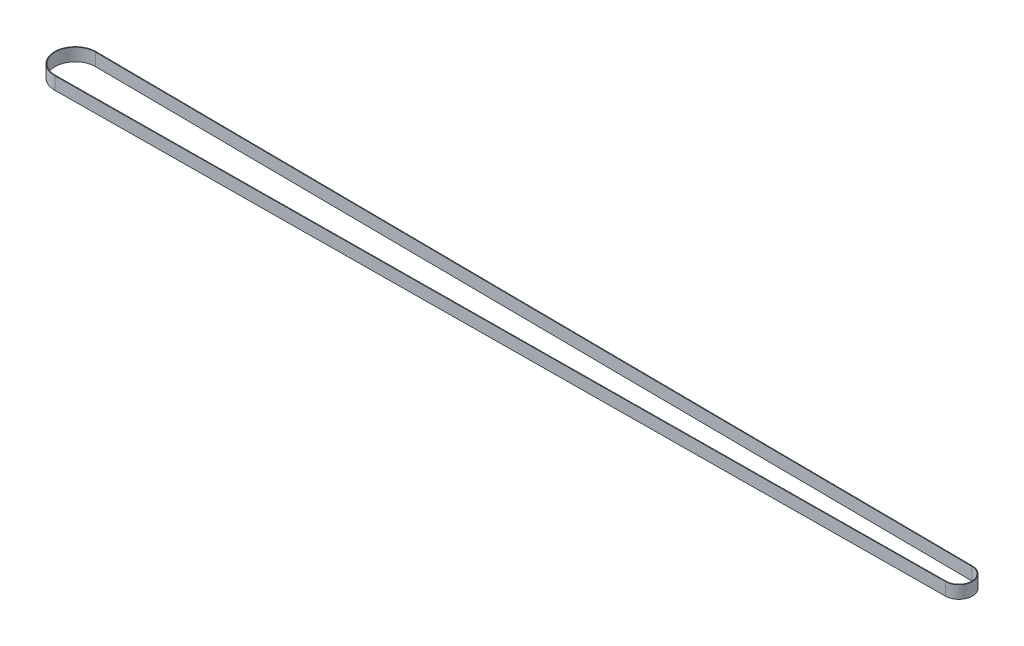
ISO-10303-21;
HEADER;
FILE_DESCRIPTION(('STEP AP214'),'2;1');
FILE_NAME('part.step','',(''),(''),'','','');
FILE_SCHEMA(('AUTOMOTIVE_DESIGN { 1 0 10303 214 1 1 1 1 }'));
ENDSEC;
DATA;
#1=APPLICATION_CONTEXT('core data for automotive mechanical design processes');
#2=APPLICATION_PROTOCOL_DEFINITION('international standard','automotive_design',2000,#1);
#3=PRODUCT_CONTEXT('',#1,'mechanical');
#4=PRODUCT('Part','Part','',(#3));
#5=PRODUCT_RELATED_PRODUCT_CATEGORY('part','',(#4));
#6=PRODUCT_DEFINITION_FORMATION('','',#4);
#7=PRODUCT_DEFINITION_CONTEXT('part definition',#1,'design');
#8=PRODUCT_DEFINITION('design','',#6,#7);
#9=PRODUCT_DEFINITION_SHAPE('','',#8);
#10=(LENGTH_UNIT() NAMED_UNIT(*) SI_UNIT(.MILLI.,.METRE.));
#11=(NAMED_UNIT(*) PLANE_ANGLE_UNIT() SI_UNIT($,.RADIAN.));
#12=(NAMED_UNIT(*) SI_UNIT($,.STERADIAN.) SOLID_ANGLE_UNIT());
#13=UNCERTAINTY_MEASURE_WITH_UNIT(LENGTH_MEASURE(1.E-05),#10,'distance_accuracy_value','');
#14=(GEOMETRIC_REPRESENTATION_CONTEXT(3) GLOBAL_UNCERTAINTY_ASSIGNED_CONTEXT((#13)) GLOBAL_UNIT_ASSIGNED_CONTEXT((#10,
#11,#12)) REPRESENTATION_CONTEXT('',''));
#15=CARTESIAN_POINT('',(0.,0.,0.));
#16=DIRECTION('',(0.,0.,1.));
#17=DIRECTION('',(1.,0.,0.));
#18=AXIS2_PLACEMENT_3D('',#15,#16,#17);
#19=CARTESIAN_POINT('',(0.0656349881038365,6.,8.02205410157994));
#20=DIRECTION('',(-0.00818154434132186,0.,-0.999966530605995));
#21=DIRECTION('',(-0.999966530605995,0.,0.00818154434132186));
#22=AXIS2_PLACEMENT_3D('',#19,#20,#21);
#23=PLANE('',#22);
#24=DIRECTION('',(0.999966530605995,0.,-0.00818154434132186));
#25=VECTOR('',#24,1.);
#26=CARTESIAN_POINT('',(0.0656349881038365,0.,8.02205410157994));
#27=LINE('',#26,#25);
#28=CARTESIAN_POINT('',(-221.966745805086,0.,9.83868267170606));
#29=VERTEX_POINT('',#28);
#30=CARTESIAN_POINT('',(196.972245325671,0.,6.41100001699983));
#31=VERTEX_POINT('',#30);
#32=EDGE_CURVE('E141',#29,#31,#27,.T.);
#33=ORIENTED_EDGE('',*,*,#32,.T.);
#34=DIRECTION('',(0.,-1.,0.));
#35=VECTOR('',#34,1.);
#36=CARTESIAN_POINT('',(196.972245325671,6.,6.41100001699983));
#37=LINE('',#36,#35);
#38=CARTESIAN_POINT('',(196.972245325671,6.,6.41100001699983));
#39=VERTEX_POINT('',#38);
#40=EDGE_CURVE('E11',#39,#31,#37,.T.);
#41=ORIENTED_EDGE('',*,*,#40,.F.);
#42=DIRECTION('',(0.999966530605995,0.,-0.00818154434132186));
#43=VECTOR('',#42,1.);
#44=CARTESIAN_POINT('',(0.0656349881038365,6.,8.02205410157994));
#45=LINE('',#44,#43);
#46=CARTESIAN_POINT('',(-221.966745805086,6.,9.83868267170606));
#47=VERTEX_POINT('',#46);
#48=EDGE_CURVE('E112',#47,#39,#45,.T.);
#49=ORIENTED_EDGE('',*,*,#48,.F.);
#50=DIRECTION('',(0.,-1.,0.));
#51=VECTOR('',#50,1.);
#52=CARTESIAN_POINT('',(-221.966745805086,6.,9.83868267170606));
#53=LINE('',#52,#51);
#54=EDGE_CURVE('E149',#47,#29,#53,.T.);
#55=ORIENTED_EDGE('',*,*,#54,.T.);
#56=EDGE_LOOP('',(#33,#41,#49,#55));
#57=FACE_BOUND('',#56,.T.);
#58=ADVANCED_FACE('F35',(#57),#23,.F.);
#59=CARTESIAN_POINT('',(196.972246791759,6.,0.));
#60=DIRECTION('',(0.,-1.,0.));
#61=DIRECTION('',(0.,0.,-1.));
#62=AXIS2_PLACEMENT_3D('',#59,#60,#61);
#63=CYLINDRICAL_SURFACE('',#62,6.41100001700001);
#64=CARTESIAN_POINT('',(196.972246791759,0.,0.));
#65=DIRECTION('',(0.,1.,0.));
#66=DIRECTION('',(0.,0.,1.));
#67=AXIS2_PLACEMENT_3D('',#64,#65,#66);
#68=CIRCLE('',#67,6.41100001700001);
#69=CARTESIAN_POINT('',(196.972246791759,0.,-6.41100001700002));
#70=VERTEX_POINT('',#69);
#71=EDGE_CURVE('E118',#31,#70,#68,.T.);
#72=ORIENTED_EDGE('',*,*,#71,.T.);
#73=DIRECTION('',(0.,-1.,0.));
#74=VECTOR('',#73,1.);
#75=CARTESIAN_POINT('',(196.972246791759,6.,-6.41100001700002));
#76=LINE('',#75,#74);
#77=CARTESIAN_POINT('',(196.972246791759,6.,-6.41100001700002));
#78=VERTEX_POINT('',#77);
#79=EDGE_CURVE('E45',#78,#70,#76,.T.);
#80=ORIENTED_EDGE('',*,*,#79,.F.);
#81=CARTESIAN_POINT('',(196.972246791759,6.,0.));
#82=DIRECTION('',(0.,1.,0.));
#83=DIRECTION('',(0.,0.,1.));
#84=AXIS2_PLACEMENT_3D('',#81,#82,#83);
#85=CIRCLE('',#84,6.41100001700001);
#86=EDGE_CURVE('E106',#39,#78,#85,.T.);
#87=ORIENTED_EDGE('',*,*,#86,.F.);
#88=ORIENTED_EDGE('',*,*,#40,.T.);
#89=EDGE_LOOP('',(#72,#80,#87,#88));
#90=FACE_BOUND('',#89,.T.);
#91=ADVANCED_FACE('F117',(#90),#63,.T.);
#92=CARTESIAN_POINT('',(0.0656349879261689,6.,-8.02205410793884));
#93=DIRECTION('',(0.0081815443126918,0.,-0.999966530606229));
#94=DIRECTION('',(-0.99996653060623,0.,-0.00818154431269181));
#95=AXIS2_PLACEMENT_3D('',#92,#93,#94);
#96=PLANE('',#95);
#97=DIRECTION('',(0.99996653060623,0.,0.00818154431269181));
#98=VECTOR('',#97,1.);
#99=CARTESIAN_POINT('',(0.0656349879261689,0.,-8.02205410793884));
#100=LINE('',#99,#98);
#101=CARTESIAN_POINT('',(-221.966745805086,0.,-9.83868267170606));
#102=VERTEX_POINT('',#101);
#103=EDGE_CURVE('E145',#102,#70,#100,.T.);
#104=ORIENTED_EDGE('',*,*,#103,.F.);
#105=DIRECTION('',(0.,-1.,0.));
#106=VECTOR('',#105,1.);
#107=CARTESIAN_POINT('',(-221.966745805086,6.,-9.83868267170606));
#108=LINE('',#107,#106);
#109=CARTESIAN_POINT('',(-221.966745805086,6.,-9.83868267170606));
#110=VERTEX_POINT('',#109);
#111=EDGE_CURVE('E82',#110,#102,#108,.T.);
#112=ORIENTED_EDGE('',*,*,#111,.F.);
#113=DIRECTION('',(0.99996653060623,0.,0.00818154431269181));
#114=VECTOR('',#113,1.);
#115=CARTESIAN_POINT('',(0.0656349879261689,6.,-8.02205410793884));
#116=LINE('',#115,#114);
#117=EDGE_CURVE('E110',#110,#78,#116,.T.);
#118=ORIENTED_EDGE('',*,*,#117,.T.);
#119=ORIENTED_EDGE('',*,*,#79,.T.);
#120=EDGE_LOOP('',(#104,#112,#118,#119));
#121=FACE_BOUND('',#120,.T.);
#122=ADVANCED_FACE('F123',(#121),#96,.T.);
#123=CARTESIAN_POINT('',(196.972246791759,6.,0.));
#124=DIRECTION('',(0.,-1.,0.));
#125=DIRECTION('',(0.,0.,-1.));
#126=AXIS2_PLACEMENT_3D('',#123,#124,#125);
#127=CYLINDRICAL_SURFACE('',#126,6.09599999999999);
#128=CARTESIAN_POINT('',(196.972246791759,0.,0.));
#129=DIRECTION('',(0.,1.,0.));
#130=DIRECTION('',(0.,0.,1.));
#131=AXIS2_PLACEMENT_3D('',#128,#129,#130);
#132=CIRCLE('',#131,6.09599999999999);
#133=CARTESIAN_POINT('',(196.972246791759,0.,6.09599999999999));
#134=VERTEX_POINT('',#133);
#135=CARTESIAN_POINT('',(196.972246791759,0.,-6.09599999999999));
#136=VERTEX_POINT('',#135);
#137=EDGE_CURVE('E129',#134,#136,#132,.T.);
#138=ORIENTED_EDGE('',*,*,#137,.F.);
#139=DIRECTION('',(0.,-1.,0.));
#140=VECTOR('',#139,1.);
#141=CARTESIAN_POINT('',(196.972246791759,6.,6.09599999999999));
#142=LINE('',#141,#140);
#143=CARTESIAN_POINT('',(196.972246791759,6.,6.09599999999999));
#144=VERTEX_POINT('',#143);
#145=EDGE_CURVE('E39',#144,#134,#142,.T.);
#146=ORIENTED_EDGE('',*,*,#145,.F.);
#147=CARTESIAN_POINT('',(196.972246791759,6.,0.));
#148=DIRECTION('',(0.,1.,0.));
#149=DIRECTION('',(0.,0.,1.));
#150=AXIS2_PLACEMENT_3D('',#147,#148,#149);
#151=CIRCLE('',#150,6.09599999999999);
#152=CARTESIAN_POINT('',(196.972246791759,6.,-6.09599999999999));
#153=VERTEX_POINT('',#152);
#154=EDGE_CURVE('E148',#144,#153,#151,.T.);
#155=ORIENTED_EDGE('',*,*,#154,.T.);
#156=DIRECTION('',(0.,-1.,0.));
#157=VECTOR('',#156,1.);
#158=CARTESIAN_POINT('',(196.972246791759,6.,-6.09599999999999));
#159=LINE('',#158,#157);
#160=EDGE_CURVE('E125',#153,#136,#159,.T.);
#161=ORIENTED_EDGE('',*,*,#160,.T.);
#162=EDGE_LOOP('',(#138,#146,#155,#161));
#163=FACE_BOUND('',#162,.T.);
#164=ADVANCED_FACE('F37',(#163),#127,.F.);
#165=CARTESIAN_POINT('',(0.0630578878522449,6.,7.70707518194105));
#166=DIRECTION('',(0.00818154434132178,0.,0.999966530605995));
#167=DIRECTION('',(0.999966530605995,0.,-0.00818154434132178));
#168=AXIS2_PLACEMENT_3D('',#165,#166,#167);
#169=PLANE('',#168);
#170=DIRECTION('',(-0.999966530605995,0.,0.00818154434132178));
#171=VECTOR('',#170,1.);
#172=CARTESIAN_POINT('',(0.0630578878522449,0.,7.70707518194105));
#173=LINE('',#172,#171);
#174=CARTESIAN_POINT('',(-221.971900005025,0.,9.52372483742822));
#175=VERTEX_POINT('',#174);
#176=EDGE_CURVE('E132',#134,#175,#173,.T.);
#177=ORIENTED_EDGE('',*,*,#176,.T.);
#178=DIRECTION('',(0.,-1.,0.));
#179=VECTOR('',#178,1.);
#180=CARTESIAN_POINT('',(-221.971900005025,6.,9.52372483742822));
#181=LINE('',#180,#179);
#182=CARTESIAN_POINT('',(-221.971900005025,6.,9.52372483742822));
#183=VERTEX_POINT('',#182);
#184=EDGE_CURVE('E154',#183,#175,#181,.T.);
#185=ORIENTED_EDGE('',*,*,#184,.F.);
#186=DIRECTION('',(-0.999966530605995,0.,0.00818154434132178));
#187=VECTOR('',#186,1.);
#188=CARTESIAN_POINT('',(0.0630578878522449,6.,7.70707518194105));
#189=LINE('',#188,#187);
#190=EDGE_CURVE('E162',#144,#183,#189,.T.);
#191=ORIENTED_EDGE('',*,*,#190,.F.);
#192=ORIENTED_EDGE('',*,*,#145,.T.);
#193=EDGE_LOOP('',(#177,#185,#191,#192));
#194=FACE_BOUND('',#193,.T.);
#195=ADVANCED_FACE('F161',(#194),#169,.F.);
#196=CARTESIAN_POINT('',(-222.127753208241,6.,0.));
#197=DIRECTION('',(0.,-1.,0.));
#198=DIRECTION('',(0.,0.,-1.));
#199=AXIS2_PLACEMENT_3D('',#196,#197,#198);
#200=CYLINDRICAL_SURFACE('',#199,9.525);
#201=CARTESIAN_POINT('',(-222.127753208241,0.,0.));
#202=DIRECTION('',(0.,1.,0.));
#203=DIRECTION('',(0.,0.,1.));
#204=AXIS2_PLACEMENT_3D('',#201,#202,#203);
#205=CIRCLE('',#204,9.525);
#206=CARTESIAN_POINT('',(-221.971898539108,0.,-9.52372481343878));
#207=VERTEX_POINT('',#206);
#208=EDGE_CURVE('E135',#207,#175,#205,.T.);
#209=ORIENTED_EDGE('',*,*,#208,.F.);
#210=DIRECTION('',(0.,-1.,0.));
#211=VECTOR('',#210,1.);
#212=CARTESIAN_POINT('',(-221.971898539108,6.,-9.52372481343878));
#213=LINE('',#212,#211);
#214=CARTESIAN_POINT('',(-221.971898539108,6.,-9.52372481343878));
#215=VERTEX_POINT('',#214);
#216=EDGE_CURVE('E153',#215,#207,#213,.T.);
#217=ORIENTED_EDGE('',*,*,#216,.F.);
#218=CARTESIAN_POINT('',(-222.127753208241,6.,0.));
#219=DIRECTION('',(0.,1.,0.));
#220=DIRECTION('',(0.,0.,1.));
#221=AXIS2_PLACEMENT_3D('',#218,#219,#220);
#222=CIRCLE('',#221,9.525);
#223=EDGE_CURVE('E202',#215,#183,#222,.T.);
#224=ORIENTED_EDGE('',*,*,#223,.T.);
#225=ORIENTED_EDGE('',*,*,#184,.T.);
#226=EDGE_LOOP('',(#209,#217,#224,#225));
#227=FACE_BOUND('',#226,.T.);
#228=ADVANCED_FACE('F174',(#227),#200,.F.);
#229=CARTESIAN_POINT('',(0.0630578875854573,6.,-7.70707517630515));
#230=DIRECTION('',(-0.00818154431269177,0.,0.999966530606229));
#231=DIRECTION('',(0.99996653060623,0.,0.00818154431269177));
#232=AXIS2_PLACEMENT_3D('',#229,#230,#231);
#233=PLANE('',#232);
#234=DIRECTION('',(-0.99996653060623,0.,-0.00818154431269177));
#235=VECTOR('',#234,1.);
#236=CARTESIAN_POINT('',(0.0630578875854573,0.,-7.70707517630515));
#237=LINE('',#236,#235);
#238=EDGE_CURVE('E138',#136,#207,#237,.T.);
#239=ORIENTED_EDGE('',*,*,#238,.F.);
#240=ORIENTED_EDGE('',*,*,#160,.F.);
#241=DIRECTION('',(-0.99996653060623,0.,-0.00818154431269177));
#242=VECTOR('',#241,1.);
#243=CARTESIAN_POINT('',(0.0630578875854573,6.,-7.70707517630515));
#244=LINE('',#243,#242);
#245=EDGE_CURVE('E172',#153,#215,#244,.T.);
#246=ORIENTED_EDGE('',*,*,#245,.T.);
#247=ORIENTED_EDGE('',*,*,#216,.T.);
#248=EDGE_LOOP('',(#239,#240,#246,#247));
#249=FACE_BOUND('',#248,.T.);
#250=ADVANCED_FACE('F171',(#249),#233,.T.);
#251=CARTESIAN_POINT('',(-222.127753208241,6.,0.));
#252=DIRECTION('',(0.,-1.,0.));
#253=DIRECTION('',(0.,0.,-1.));
#254=AXIS2_PLACEMENT_3D('',#251,#252,#253);
#255=CYLINDRICAL_SURFACE('',#254,9.84000000499999);
#256=CARTESIAN_POINT('',(-222.127753208241,0.,0.));
#257=DIRECTION('',(0.,1.,0.));
#258=DIRECTION('',(0.,0.,1.));
#259=AXIS2_PLACEMENT_3D('',#256,#257,#258);
#260=CIRCLE('',#259,9.84000000499999);
#261=EDGE_CURVE('E85',#102,#29,#260,.T.);
#262=ORIENTED_EDGE('',*,*,#261,.T.);
#263=ORIENTED_EDGE('',*,*,#54,.F.);
#264=CARTESIAN_POINT('',(-222.127753208241,6.,0.));
#265=DIRECTION('',(0.,1.,0.));
#266=DIRECTION('',(0.,0.,1.));
#267=AXIS2_PLACEMENT_3D('',#264,#265,#266);
#268=CIRCLE('',#267,9.84000000499999);
#269=EDGE_CURVE('E54',#110,#47,#268,.T.);
#270=ORIENTED_EDGE('',*,*,#269,.F.);
#271=ORIENTED_EDGE('',*,*,#111,.T.);
#272=EDGE_LOOP('',(#262,#263,#270,#271));
#273=FACE_BOUND('',#272,.T.);
#274=ADVANCED_FACE('F181',(#273),#255,.T.);
#275=CARTESIAN_POINT('',(0.,6.,0.));
#276=DIRECTION('',(0.,1.,0.));
#277=DIRECTION('',(0.,0.,1.));
#278=AXIS2_PLACEMENT_3D('',#275,#276,#277);
#279=PLANE('',#278);
#280=ORIENTED_EDGE('',*,*,#154,.F.);
#281=ORIENTED_EDGE('',*,*,#190,.T.);
#282=ORIENTED_EDGE('',*,*,#223,.F.);
#283=ORIENTED_EDGE('',*,*,#245,.F.);
#284=EDGE_LOOP('',(#280,#281,#282,#283));
#285=FACE_BOUND('',#284,.T.);
#286=ORIENTED_EDGE('',*,*,#48,.T.);
#287=ORIENTED_EDGE('',*,*,#86,.T.);
#288=ORIENTED_EDGE('',*,*,#117,.F.);
#289=ORIENTED_EDGE('',*,*,#269,.T.);
#290=EDGE_LOOP('',(#286,#287,#288,#289));
#291=FACE_BOUND('',#290,.T.);
#292=ADVANCED_FACE('F108',(#285,#291),#279,.T.);
#293=CARTESIAN_POINT('',(0.,0.,0.));
#294=DIRECTION('',(0.,1.,0.));
#295=DIRECTION('',(0.,0.,1.));
#296=AXIS2_PLACEMENT_3D('',#293,#294,#295);
#297=PLANE('',#296);
#298=ORIENTED_EDGE('',*,*,#137,.T.);
#299=ORIENTED_EDGE('',*,*,#238,.T.);
#300=ORIENTED_EDGE('',*,*,#208,.T.);
#301=ORIENTED_EDGE('',*,*,#176,.F.);
#302=EDGE_LOOP('',(#298,#299,#300,#301));
#303=FACE_BOUND('',#302,.T.);
#304=ORIENTED_EDGE('',*,*,#32,.F.);
#305=ORIENTED_EDGE('',*,*,#261,.F.);
#306=ORIENTED_EDGE('',*,*,#103,.T.);
#307=ORIENTED_EDGE('',*,*,#71,.F.);
#308=EDGE_LOOP('',(#304,#305,#306,#307));
#309=FACE_BOUND('',#308,.T.);
#310=ADVANCED_FACE('F165',(#303,#309),#297,.F.);
#311=CLOSED_SHELL('',(#58,#91,#122,#164,#195,#228,#250,#274,#292,#310));
#312=MANIFOLD_SOLID_BREP('B2',#311);
#313=ADVANCED_BREP_SHAPE_REPRESENTATION('',(#18,#312),#14);
#314=SHAPE_DEFINITION_REPRESENTATION(#9,#313);
ENDSEC;
END-ISO-10303-21;
